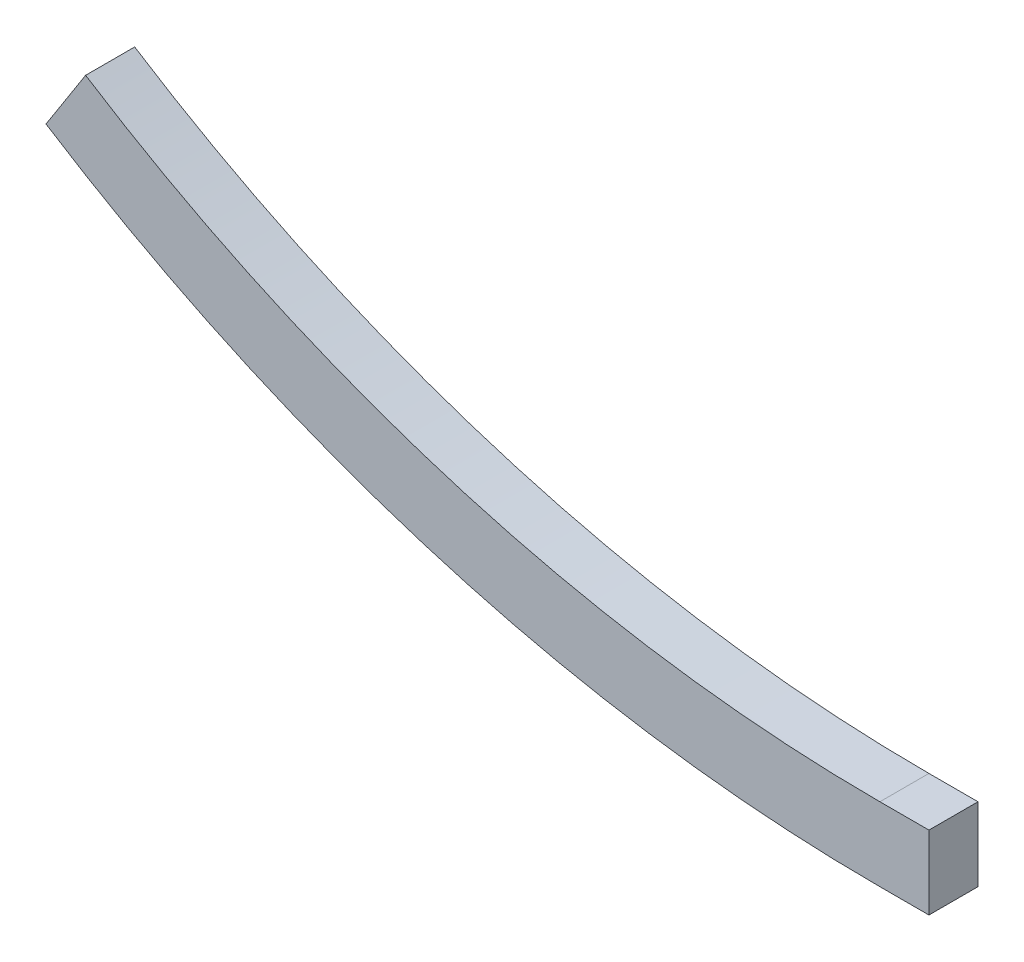
ISO-10303-21;
HEADER;
FILE_DESCRIPTION(('STEP AP214'),'2;1');
FILE_NAME('part.step','',(''),(''),'','','');
FILE_SCHEMA(('AUTOMOTIVE_DESIGN { 1 0 10303 214 1 1 1 1 }'));
ENDSEC;
DATA;
#1=APPLICATION_CONTEXT('core data for automotive mechanical design processes');
#2=APPLICATION_PROTOCOL_DEFINITION('international standard','automotive_design',2000,#1);
#3=PRODUCT_CONTEXT('',#1,'mechanical');
#4=PRODUCT('Part','Part','',(#3));
#5=PRODUCT_RELATED_PRODUCT_CATEGORY('part','',(#4));
#6=PRODUCT_DEFINITION_FORMATION('','',#4);
#7=PRODUCT_DEFINITION_CONTEXT('part definition',#1,'design');
#8=PRODUCT_DEFINITION('design','',#6,#7);
#9=PRODUCT_DEFINITION_SHAPE('','',#8);
#10=(LENGTH_UNIT() NAMED_UNIT(*) SI_UNIT(.MILLI.,.METRE.));
#11=(NAMED_UNIT(*) PLANE_ANGLE_UNIT() SI_UNIT($,.RADIAN.));
#12=(NAMED_UNIT(*) SI_UNIT($,.STERADIAN.) SOLID_ANGLE_UNIT());
#13=UNCERTAINTY_MEASURE_WITH_UNIT(LENGTH_MEASURE(1.E-05),#10,'distance_accuracy_value','');
#14=(GEOMETRIC_REPRESENTATION_CONTEXT(3) GLOBAL_UNCERTAINTY_ASSIGNED_CONTEXT((#13)) GLOBAL_UNIT_ASSIGNED_CONTEXT((#10,
#11,#12)) REPRESENTATION_CONTEXT('',''));
#15=CARTESIAN_POINT('',(0.,0.,0.));
#16=DIRECTION('',(0.,0.,1.));
#17=DIRECTION('',(1.,0.,0.));
#18=AXIS2_PLACEMENT_3D('',#15,#16,#17);
#19=CARTESIAN_POINT('',(180.,-49.6538863977263,10.));
#20=DIRECTION('',(0.,1.,0.));
#21=DIRECTION('',(-1.,0.,0.));
#22=AXIS2_PLACEMENT_3D('',#19,#20,#21);
#23=PLANE('',#22);
#24=DIRECTION('',(1.,0.,0.));
#25=VECTOR('',#24,1.);
#26=CARTESIAN_POINT('',(180.,-49.6538863977263,0.));
#27=LINE('',#26,#25);
#28=CARTESIAN_POINT('',(170.,-49.6538863977261,0.));
#29=VERTEX_POINT('',#28);
#30=CARTESIAN_POINT('',(180.,-49.6538863977263,0.));
#31=VERTEX_POINT('',#30);
#32=EDGE_CURVE('E116',#29,#31,#27,.T.);
#33=ORIENTED_EDGE('',*,*,#32,.T.);
#34=DIRECTION('',(0.,0.,-1.));
#35=VECTOR('',#34,1.);
#36=CARTESIAN_POINT('',(180.,-49.6538863977263,10.));
#37=LINE('',#36,#35);
#38=CARTESIAN_POINT('',(180.,-49.6538863977263,10.));
#39=VERTEX_POINT('',#38);
#40=EDGE_CURVE('E11',#39,#31,#37,.T.);
#41=ORIENTED_EDGE('',*,*,#40,.F.);
#42=DIRECTION('',(1.,0.,0.));
#43=VECTOR('',#42,1.);
#44=CARTESIAN_POINT('',(180.,-49.6538863977263,10.));
#45=LINE('',#44,#43);
#46=CARTESIAN_POINT('',(170.,-49.6538863977261,10.));
#47=VERTEX_POINT('',#46);
#48=EDGE_CURVE('E126',#47,#39,#45,.T.);
#49=ORIENTED_EDGE('',*,*,#48,.F.);
#50=DIRECTION('',(0.,0.,-1.));
#51=VECTOR('',#50,1.);
#52=CARTESIAN_POINT('',(170.,-49.6538863977261,10.));
#53=LINE('',#52,#51);
#54=EDGE_CURVE('E112',#47,#29,#53,.T.);
#55=ORIENTED_EDGE('',*,*,#54,.T.);
#56=EDGE_LOOP('',(#33,#41,#49,#55));
#57=FACE_BOUND('',#56,.T.);
#58=ADVANCED_FACE('F32',(#57),#23,.F.);
#59=CARTESIAN_POINT('',(180.,-34.6538862404341,10.));
#60=DIRECTION('',(-1.,0.,0.));
#61=DIRECTION('',(0.,0.,1.));
#62=AXIS2_PLACEMENT_3D('',#59,#60,#61);
#63=PLANE('',#62);
#64=DIRECTION('',(0.,1.,0.));
#65=VECTOR('',#64,1.);
#66=CARTESIAN_POINT('',(180.,-34.6538862404341,0.));
#67=LINE('',#66,#65);
#68=CARTESIAN_POINT('',(180.,-34.6538862404341,0.));
#69=VERTEX_POINT('',#68);
#70=EDGE_CURVE('E119',#31,#69,#67,.T.);
#71=ORIENTED_EDGE('',*,*,#70,.T.);
#72=DIRECTION('',(0.,0.,-1.));
#73=VECTOR('',#72,1.);
#74=CARTESIAN_POINT('',(180.,-34.6538862404341,10.));
#75=LINE('',#74,#73);
#76=CARTESIAN_POINT('',(180.,-34.6538862404341,10.));
#77=VERTEX_POINT('',#76);
#78=EDGE_CURVE('E40',#77,#69,#75,.T.);
#79=ORIENTED_EDGE('',*,*,#78,.F.);
#80=DIRECTION('',(0.,1.,0.));
#81=VECTOR('',#80,1.);
#82=CARTESIAN_POINT('',(180.,-34.6538862404341,10.));
#83=LINE('',#82,#81);
#84=EDGE_CURVE('E85',#39,#77,#83,.T.);
#85=ORIENTED_EDGE('',*,*,#84,.F.);
#86=ORIENTED_EDGE('',*,*,#40,.T.);
#87=EDGE_LOOP('',(#71,#79,#85,#86));
#88=FACE_BOUND('',#87,.T.);
#89=ADVANCED_FACE('F150',(#88),#63,.F.);
#90=CARTESIAN_POINT('',(170.,-34.6538862404341,10.));
#91=DIRECTION('',(0.,-1.,0.));
#92=DIRECTION('',(1.,0.,0.));
#93=AXIS2_PLACEMENT_3D('',#90,#91,#92);
#94=PLANE('',#93);
#95=DIRECTION('',(-1.,0.,0.));
#96=VECTOR('',#95,1.);
#97=CARTESIAN_POINT('',(170.,-34.6538862404341,0.));
#98=LINE('',#97,#96);
#99=CARTESIAN_POINT('',(170.,-34.6538862404341,0.));
#100=VERTEX_POINT('',#99);
#101=EDGE_CURVE('E121',#69,#100,#98,.T.);
#102=ORIENTED_EDGE('',*,*,#101,.T.);
#103=DIRECTION('',(0.,0.,-1.));
#104=VECTOR('',#103,1.);
#105=CARTESIAN_POINT('',(170.,-34.6538862404341,10.));
#106=LINE('',#105,#104);
#107=CARTESIAN_POINT('',(170.,-34.6538862404341,10.));
#108=VERTEX_POINT('',#107);
#109=EDGE_CURVE('E107',#108,#100,#106,.T.);
#110=ORIENTED_EDGE('',*,*,#109,.F.);
#111=DIRECTION('',(-1.,0.,0.));
#112=VECTOR('',#111,1.);
#113=CARTESIAN_POINT('',(170.,-34.6538862404341,10.));
#114=LINE('',#113,#112);
#115=EDGE_CURVE('E98',#77,#108,#114,.T.);
#116=ORIENTED_EDGE('',*,*,#115,.F.);
#117=ORIENTED_EDGE('',*,*,#78,.T.);
#118=EDGE_LOOP('',(#102,#110,#116,#117));
#119=FACE_BOUND('',#118,.T.);
#120=ADVANCED_FACE('F132',(#119),#94,.F.);
#121=CARTESIAN_POINT('',(169.95538190434,266.034779246274,10.));
#122=DIRECTION('',(0.,0.,-1.));
#123=DIRECTION('',(-1.,0.,0.));
#124=AXIS2_PLACEMENT_3D('',#121,#122,#123);
#125=CYLINDRICAL_SURFACE('',#124,300.688668797067);
#126=CARTESIAN_POINT('',(169.95538190434,266.034779246274,0.));
#127=DIRECTION('',(0.,0.,-1.));
#128=DIRECTION('',(1.,0.,0.));
#129=AXIS2_PLACEMENT_3D('',#126,#127,#128);
#130=CIRCLE('',#129,300.688668797067);
#131=CARTESIAN_POINT('',(8.07545845177216,12.6406871171507,0.));
#132=VERTEX_POINT('',#131);
#133=EDGE_CURVE('E106',#100,#132,#130,.T.);
#134=ORIENTED_EDGE('',*,*,#133,.T.);
#135=DIRECTION('',(0.,0.,-1.));
#136=VECTOR('',#135,1.);
#137=CARTESIAN_POINT('',(8.07545845177216,12.6406871171507,10.));
#138=LINE('',#137,#136);
#139=CARTESIAN_POINT('',(8.07545845177216,12.6406871171507,10.));
#140=VERTEX_POINT('',#139);
#141=EDGE_CURVE('E103',#140,#132,#138,.T.);
#142=ORIENTED_EDGE('',*,*,#141,.F.);
#143=CARTESIAN_POINT('',(169.95538190434,266.034779246274,10.));
#144=DIRECTION('',(0.,0.,-1.));
#145=DIRECTION('',(1.,0.,0.));
#146=AXIS2_PLACEMENT_3D('',#143,#144,#145);
#147=CIRCLE('',#146,300.688668797067);
#148=EDGE_CURVE('E92',#108,#140,#147,.T.);
#149=ORIENTED_EDGE('',*,*,#148,.F.);
#150=ORIENTED_EDGE('',*,*,#109,.T.);
#151=EDGE_LOOP('',(#134,#142,#149,#150));
#152=FACE_BOUND('',#151,.T.);
#153=ADVANCED_FACE('F104',(#152),#125,.F.);
#154=CARTESIAN_POINT('',(3.13638004456607E-12,-1.4432899320127E-12,10.));
#155=DIRECTION('',(0.842712474476836,-0.538363896784627,0.));
#156=DIRECTION('',(0.538363896784627,0.842712474476836,0.));
#157=AXIS2_PLACEMENT_3D('',#154,#155,#156);
#158=PLANE('',#157);
#159=DIRECTION('',(-0.538363896784627,-0.842712474476836,0.));
#160=VECTOR('',#159,1.);
#161=CARTESIAN_POINT('',(3.13638004456607E-12,-1.4432899320127E-12,0.));
#162=LINE('',#161,#160);
#163=CARTESIAN_POINT('',(3.13638004456607E-12,-1.4432899320127E-12,0.));
#164=VERTEX_POINT('',#163);
#165=EDGE_CURVE('E71',#132,#164,#162,.T.);
#166=ORIENTED_EDGE('',*,*,#165,.T.);
#167=DIRECTION('',(0.,0.,-1.));
#168=VECTOR('',#167,1.);
#169=CARTESIAN_POINT('',(3.13638004456607E-12,-1.4432899320127E-12,10.));
#170=LINE('',#169,#168);
#171=CARTESIAN_POINT('',(3.13638004456607E-12,-1.4432899320127E-12,10.));
#172=VERTEX_POINT('',#171);
#173=EDGE_CURVE('E108',#172,#164,#170,.T.);
#174=ORIENTED_EDGE('',*,*,#173,.F.);
#175=DIRECTION('',(-0.538363896784627,-0.842712474476836,0.));
#176=VECTOR('',#175,1.);
#177=CARTESIAN_POINT('',(3.13638004456607E-12,-1.4432899320127E-12,10.));
#178=LINE('',#177,#176);
#179=EDGE_CURVE('E96',#140,#172,#178,.T.);
#180=ORIENTED_EDGE('',*,*,#179,.F.);
#181=ORIENTED_EDGE('',*,*,#141,.T.);
#182=EDGE_LOOP('',(#166,#174,#180,#181));
#183=FACE_BOUND('',#182,.T.);
#184=ADVANCED_FACE('F110',(#183),#158,.F.);
#185=CARTESIAN_POINT('',(169.95538190434,266.034779246274,10.));
#186=DIRECTION('',(0.,0.,-1.));
#187=DIRECTION('',(-1.,0.,0.));
#188=AXIS2_PLACEMENT_3D('',#185,#186,#187);
#189=CYLINDRICAL_SURFACE('',#188,315.688668797066);
#190=CARTESIAN_POINT('',(169.95538190434,266.034779246274,0.));
#191=DIRECTION('',(0.,0.,1.));
#192=DIRECTION('',(1.,0.,0.));
#193=AXIS2_PLACEMENT_3D('',#190,#191,#192);
#194=CIRCLE('',#193,315.688668797066);
#195=EDGE_CURVE('E77',#164,#29,#194,.T.);
#196=ORIENTED_EDGE('',*,*,#195,.T.);
#197=ORIENTED_EDGE('',*,*,#54,.F.);
#198=CARTESIAN_POINT('',(169.95538190434,266.034779246274,10.));
#199=DIRECTION('',(0.,0.,1.));
#200=DIRECTION('',(1.,0.,0.));
#201=AXIS2_PLACEMENT_3D('',#198,#199,#200);
#202=CIRCLE('',#201,315.688668797066);
#203=EDGE_CURVE('E48',#172,#47,#202,.T.);
#204=ORIENTED_EDGE('',*,*,#203,.F.);
#205=ORIENTED_EDGE('',*,*,#173,.T.);
#206=EDGE_LOOP('',(#196,#197,#204,#205));
#207=FACE_BOUND('',#206,.T.);
#208=ADVANCED_FACE('F139',(#207),#189,.T.);
#209=CARTESIAN_POINT('',(169.95538190434,266.034779246274,10.));
#210=DIRECTION('',(0.,0.,1.));
#211=DIRECTION('',(1.,0.,0.));
#212=AXIS2_PLACEMENT_3D('',#209,#210,#211);
#213=PLANE('',#212);
#214=ORIENTED_EDGE('',*,*,#48,.T.);
#215=ORIENTED_EDGE('',*,*,#84,.T.);
#216=ORIENTED_EDGE('',*,*,#115,.T.);
#217=ORIENTED_EDGE('',*,*,#148,.T.);
#218=ORIENTED_EDGE('',*,*,#179,.T.);
#219=ORIENTED_EDGE('',*,*,#203,.T.);
#220=EDGE_LOOP('',(#214,#215,#216,#217,#218,#219));
#221=FACE_BOUND('',#220,.T.);
#222=ADVANCED_FACE('F94',(#221),#213,.T.);
#223=CARTESIAN_POINT('',(169.95538190434,266.034779246274,0.));
#224=DIRECTION('',(0.,0.,1.));
#225=DIRECTION('',(1.,0.,0.));
#226=AXIS2_PLACEMENT_3D('',#223,#224,#225);
#227=PLANE('',#226);
#228=ORIENTED_EDGE('',*,*,#32,.F.);
#229=ORIENTED_EDGE('',*,*,#195,.F.);
#230=ORIENTED_EDGE('',*,*,#165,.F.);
#231=ORIENTED_EDGE('',*,*,#133,.F.);
#232=ORIENTED_EDGE('',*,*,#101,.F.);
#233=ORIENTED_EDGE('',*,*,#70,.F.);
#234=EDGE_LOOP('',(#228,#229,#230,#231,#232,#233));
#235=FACE_BOUND('',#234,.T.);
#236=ADVANCED_FACE('F135',(#235),#227,.F.);
#237=CLOSED_SHELL('',(#58,#89,#120,#153,#184,#208,#222,#236));
#238=MANIFOLD_SOLID_BREP('B2',#237);
#239=ADVANCED_BREP_SHAPE_REPRESENTATION('',(#18,#238),#14);
#240=SHAPE_DEFINITION_REPRESENTATION(#9,#239);
ENDSEC;
END-ISO-10303-21;
